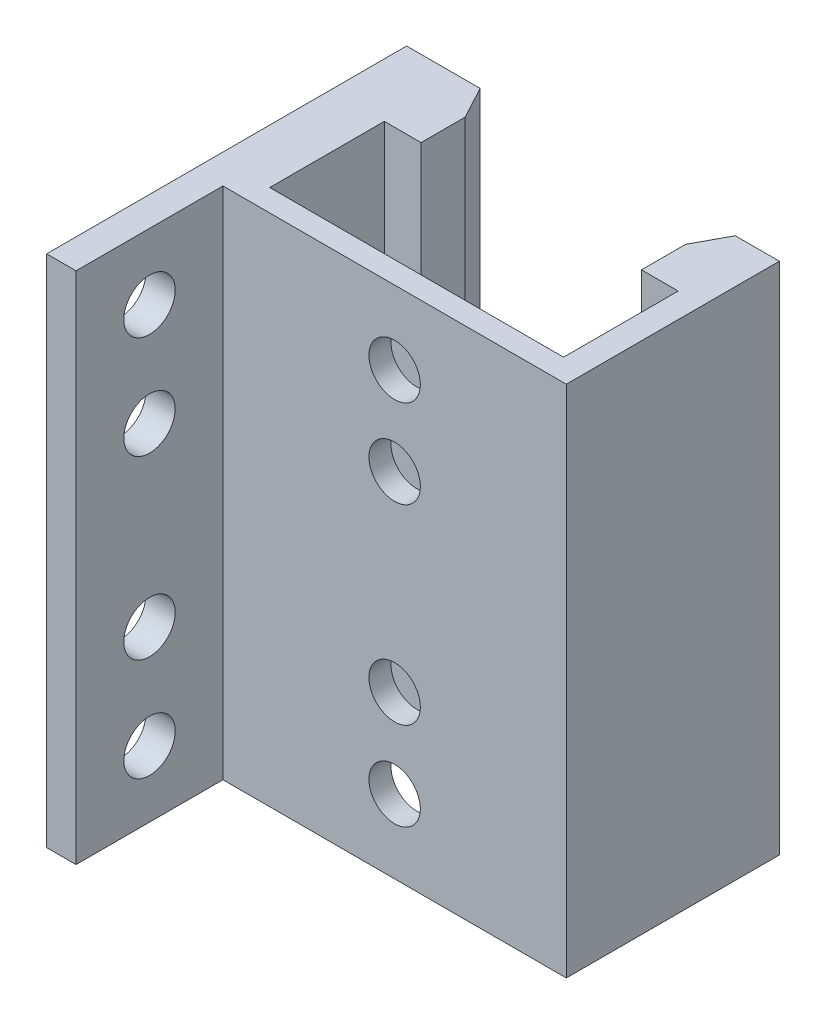
ISO-10303-21;
HEADER;
FILE_DESCRIPTION(('STEP AP214'),'2;1');
FILE_NAME('part.step','',(''),(''),'','','');
FILE_SCHEMA(('AUTOMOTIVE_DESIGN { 1 0 10303 214 1 1 1 1 }'));
ENDSEC;
DATA;
#1=APPLICATION_CONTEXT('core data for automotive mechanical design processes');
#2=APPLICATION_PROTOCOL_DEFINITION('international standard','automotive_design',2000,#1);
#3=PRODUCT_CONTEXT('',#1,'mechanical');
#4=PRODUCT('Part','Part','',(#3));
#5=PRODUCT_RELATED_PRODUCT_CATEGORY('part','',(#4));
#6=PRODUCT_DEFINITION_FORMATION('','',#4);
#7=PRODUCT_DEFINITION_CONTEXT('part definition',#1,'design');
#8=PRODUCT_DEFINITION('design','',#6,#7);
#9=PRODUCT_DEFINITION_SHAPE('','',#8);
#10=(LENGTH_UNIT() NAMED_UNIT(*) SI_UNIT(.MILLI.,.METRE.));
#11=(NAMED_UNIT(*) PLANE_ANGLE_UNIT() SI_UNIT($,.RADIAN.));
#12=(NAMED_UNIT(*) SI_UNIT($,.STERADIAN.) SOLID_ANGLE_UNIT());
#13=UNCERTAINTY_MEASURE_WITH_UNIT(LENGTH_MEASURE(1.E-05),#10,'distance_accuracy_value','');
#14=(GEOMETRIC_REPRESENTATION_CONTEXT(3) GLOBAL_UNCERTAINTY_ASSIGNED_CONTEXT((#13)) GLOBAL_UNIT_ASSIGNED_CONTEXT((#10,
#11,#12)) REPRESENTATION_CONTEXT('',''));
#15=CARTESIAN_POINT('',(0.,0.,0.));
#16=DIRECTION('',(0.,0.,1.));
#17=DIRECTION('',(1.,0.,0.));
#18=AXIS2_PLACEMENT_3D('',#15,#16,#17);
#19=CARTESIAN_POINT('',(9.99999999999999,35.,-9.3));
#20=DIRECTION('',(1.,0.,0.));
#21=DIRECTION('',(0.,0.,-1.));
#22=AXIS2_PLACEMENT_3D('',#19,#20,#21);
#23=PLANE('',#22);
#24=DIRECTION('',(0.,0.,1.));
#25=VECTOR('',#24,1.);
#26=CARTESIAN_POINT('',(9.99999999999999,0.,-9.3));
#27=LINE('',#26,#25);
#28=CARTESIAN_POINT('',(9.99999999999999,0.,-9.3));
#29=VERTEX_POINT('',#28);
#30=CARTESIAN_POINT('',(10.,0.,-1.5));
#31=VERTEX_POINT('',#30);
#32=EDGE_CURVE('E161',#29,#31,#27,.T.);
#33=ORIENTED_EDGE('',*,*,#32,.T.);
#34=DIRECTION('',(0.,-1.,0.));
#35=VECTOR('',#34,1.);
#36=CARTESIAN_POINT('',(10.,35.,-1.5));
#37=LINE('',#36,#35);
#38=CARTESIAN_POINT('',(10.,35.,-1.5));
#39=VERTEX_POINT('',#38);
#40=EDGE_CURVE('E11',#39,#31,#37,.T.);
#41=ORIENTED_EDGE('',*,*,#40,.F.);
#42=DIRECTION('',(0.,0.,1.));
#43=VECTOR('',#42,1.);
#44=CARTESIAN_POINT('',(9.99999999999999,35.,-9.3));
#45=LINE('',#44,#43);
#46=CARTESIAN_POINT('',(9.99999999999999,35.,-9.3));
#47=VERTEX_POINT('',#46);
#48=EDGE_CURVE('E191',#47,#39,#45,.T.);
#49=ORIENTED_EDGE('',*,*,#48,.F.);
#50=DIRECTION('',(0.,-1.,0.));
#51=VECTOR('',#50,1.);
#52=CARTESIAN_POINT('',(9.99999999999999,35.,-9.3));
#53=LINE('',#52,#51);
#54=EDGE_CURVE('E157',#47,#29,#53,.T.);
#55=ORIENTED_EDGE('',*,*,#54,.T.);
#56=EDGE_LOOP('',(#33,#41,#49,#55));
#57=FACE_BOUND('',#56,.T.);
#58=ADVANCED_FACE('F33',(#57),#23,.F.);
#59=CARTESIAN_POINT('',(10.,35.,-1.5));
#60=DIRECTION('',(0.,0.,1.));
#61=DIRECTION('',(1.,0.,0.));
#62=AXIS2_PLACEMENT_3D('',#59,#60,#61);
#63=PLANE('',#62);
#64=CARTESIAN_POINT('',(0.,11.,-1.49999999999998));
#65=DIRECTION('',(0.,0.,1.));
#66=DIRECTION('',(1.,0.,0.));
#67=AXIS2_PLACEMENT_3D('',#64,#65,#66);
#68=CIRCLE('',#67,1.75);
#69=CARTESIAN_POINT('',(1.75,11.,-1.49999999999998));
#70=VERTEX_POINT('',#69);
#71=EDGE_CURVE('E256',#70,#70,#68,.T.);
#72=ORIENTED_EDGE('',*,*,#71,.T.);
#73=EDGE_LOOP('',(#72));
#74=FACE_BOUND('',#73,.T.);
#75=CARTESIAN_POINT('',(0.,30.,-1.49999999999998));
#76=DIRECTION('',(0.,0.,1.));
#77=DIRECTION('',(1.,0.,0.));
#78=AXIS2_PLACEMENT_3D('',#75,#76,#77);
#79=CIRCLE('',#78,1.75);
#80=CARTESIAN_POINT('',(1.75,30.,-1.49999999999998));
#81=VERTEX_POINT('',#80);
#82=EDGE_CURVE('E250',#81,#81,#79,.T.);
#83=ORIENTED_EDGE('',*,*,#82,.T.);
#84=EDGE_LOOP('',(#83));
#85=FACE_BOUND('',#84,.T.);
#86=CARTESIAN_POINT('',(0.,5.,-1.49999999999998));
#87=DIRECTION('',(0.,0.,1.));
#88=DIRECTION('',(1.,0.,0.));
#89=AXIS2_PLACEMENT_3D('',#86,#87,#88);
#90=CIRCLE('',#89,1.75);
#91=CARTESIAN_POINT('',(1.75,5.,-1.49999999999998));
#92=VERTEX_POINT('',#91);
#93=EDGE_CURVE('E244',#92,#92,#90,.T.);
#94=ORIENTED_EDGE('',*,*,#93,.T.);
#95=EDGE_LOOP('',(#94));
#96=FACE_BOUND('',#95,.T.);
#97=CARTESIAN_POINT('',(0.,24.,-1.49999999999998));
#98=DIRECTION('',(0.,0.,1.));
#99=DIRECTION('',(1.,0.,0.));
#100=AXIS2_PLACEMENT_3D('',#97,#98,#99);
#101=CIRCLE('',#100,1.75);
#102=CARTESIAN_POINT('',(1.75,24.,-1.49999999999998));
#103=VERTEX_POINT('',#102);
#104=EDGE_CURVE('E165',#103,#103,#101,.T.);
#105=ORIENTED_EDGE('',*,*,#104,.T.);
#106=EDGE_LOOP('',(#105));
#107=FACE_BOUND('',#106,.T.);
#108=DIRECTION('',(-1.,0.,0.));
#109=VECTOR('',#108,1.);
#110=CARTESIAN_POINT('',(10.,0.,-1.5));
#111=LINE('',#110,#109);
#112=CARTESIAN_POINT('',(-10.,0.,-1.49999999999995));
#113=VERTEX_POINT('',#112);
#114=EDGE_CURVE('E164',#31,#113,#111,.T.);
#115=ORIENTED_EDGE('',*,*,#114,.T.);
#116=DIRECTION('',(0.,-1.,0.));
#117=VECTOR('',#116,1.);
#118=CARTESIAN_POINT('',(-10.,35.,-1.49999999999995));
#119=LINE('',#118,#117);
#120=CARTESIAN_POINT('',(-10.,35.,-1.49999999999995));
#121=VERTEX_POINT('',#120);
#122=EDGE_CURVE('E42',#121,#113,#119,.T.);
#123=ORIENTED_EDGE('',*,*,#122,.F.);
#124=DIRECTION('',(-1.,0.,0.));
#125=VECTOR('',#124,1.);
#126=CARTESIAN_POINT('',(10.,35.,-1.5));
#127=LINE('',#126,#125);
#128=EDGE_CURVE('E110',#39,#121,#127,.T.);
#129=ORIENTED_EDGE('',*,*,#128,.F.);
#130=ORIENTED_EDGE('',*,*,#40,.T.);
#131=EDGE_LOOP('',(#115,#123,#129,#130));
#132=FACE_BOUND('',#131,.T.);
#133=ADVANCED_FACE('F348',(#74,#85,#96,#107,#132),#63,.F.);
#134=CARTESIAN_POINT('',(-10.,35.,-9.29999999999995));
#135=DIRECTION('',(1.,0.,0.));
#136=DIRECTION('',(0.,0.,-1.));
#137=AXIS2_PLACEMENT_3D('',#134,#135,#136);
#138=PLANE('',#137);
#139=DIRECTION('',(0.,0.,1.));
#140=VECTOR('',#139,1.);
#141=CARTESIAN_POINT('',(-10.,0.,-9.29999999999995));
#142=LINE('',#141,#140);
#143=CARTESIAN_POINT('',(-10.,0.,-9.29999999999995));
#144=VERTEX_POINT('',#143);
#145=EDGE_CURVE('E168',#144,#113,#142,.T.);
#146=ORIENTED_EDGE('',*,*,#145,.F.);
#147=DIRECTION('',(0.,-1.,0.));
#148=VECTOR('',#147,1.);
#149=CARTESIAN_POINT('',(-10.,35.,-9.29999999999995));
#150=LINE('',#149,#148);
#151=CARTESIAN_POINT('',(-10.,35.,-9.29999999999995));
#152=VERTEX_POINT('',#151);
#153=EDGE_CURVE('E343',#152,#144,#150,.T.);
#154=ORIENTED_EDGE('',*,*,#153,.F.);
#155=DIRECTION('',(0.,0.,1.));
#156=VECTOR('',#155,1.);
#157=CARTESIAN_POINT('',(-10.,35.,-9.29999999999995));
#158=LINE('',#157,#156);
#159=EDGE_CURVE('E234',#152,#121,#158,.T.);
#160=ORIENTED_EDGE('',*,*,#159,.T.);
#161=ORIENTED_EDGE('',*,*,#122,.T.);
#162=EDGE_LOOP('',(#146,#154,#160,#161));
#163=FACE_BOUND('',#162,.T.);
#164=ADVANCED_FACE('F347',(#163),#138,.T.);
#165=CARTESIAN_POINT('',(-7.50000000000004,35.,-9.29999999999996));
#166=DIRECTION('',(0.,0.,1.));
#167=DIRECTION('',(1.,0.,0.));
#168=AXIS2_PLACEMENT_3D('',#165,#166,#167);
#169=PLANE('',#168);
#170=DIRECTION('',(-1.,0.,0.));
#171=VECTOR('',#170,1.);
#172=CARTESIAN_POINT('',(-7.50000000000004,0.,-9.29999999999996));
#173=LINE('',#172,#171);
#174=CARTESIAN_POINT('',(-7.50000000000004,0.,-9.29999999999996));
#175=VERTEX_POINT('',#174);
#176=EDGE_CURVE('E171',#175,#144,#173,.T.);
#177=ORIENTED_EDGE('',*,*,#176,.F.);
#178=DIRECTION('',(0.,-1.,0.));
#179=VECTOR('',#178,1.);
#180=CARTESIAN_POINT('',(-7.50000000000004,35.,-9.29999999999996));
#181=LINE('',#180,#179);
#182=CARTESIAN_POINT('',(-7.50000000000004,35.,-9.29999999999996));
#183=VERTEX_POINT('',#182);
#184=EDGE_CURVE('E336',#183,#175,#181,.T.);
#185=ORIENTED_EDGE('',*,*,#184,.F.);
#186=DIRECTION('',(-1.,0.,0.));
#187=VECTOR('',#186,1.);
#188=CARTESIAN_POINT('',(-7.50000000000004,35.,-9.29999999999996));
#189=LINE('',#188,#187);
#190=EDGE_CURVE('E231',#183,#152,#189,.T.);
#191=ORIENTED_EDGE('',*,*,#190,.T.);
#192=ORIENTED_EDGE('',*,*,#153,.T.);
#193=EDGE_LOOP('',(#177,#185,#191,#192));
#194=FACE_BOUND('',#193,.T.);
#195=ADVANCED_FACE('F341',(#194),#169,.T.);
#196=CARTESIAN_POINT('',(-7.50000000000005,35.,-12.3));
#197=DIRECTION('',(1.,0.,0.));
#198=DIRECTION('',(0.,0.,-1.));
#199=AXIS2_PLACEMENT_3D('',#196,#197,#198);
#200=PLANE('',#199);
#201=DIRECTION('',(0.,0.,1.));
#202=VECTOR('',#201,1.);
#203=CARTESIAN_POINT('',(-7.50000000000005,0.,-12.3));
#204=LINE('',#203,#202);
#205=CARTESIAN_POINT('',(-7.50000000000005,0.,-12.3));
#206=VERTEX_POINT('',#205);
#207=EDGE_CURVE('E174',#206,#175,#204,.T.);
#208=ORIENTED_EDGE('',*,*,#207,.F.);
#209=DIRECTION('',(0.,-1.,0.));
#210=VECTOR('',#209,1.);
#211=CARTESIAN_POINT('',(-7.50000000000005,35.,-12.3));
#212=LINE('',#211,#210);
#213=CARTESIAN_POINT('',(-7.50000000000005,35.,-12.3));
#214=VERTEX_POINT('',#213);
#215=EDGE_CURVE('E331',#214,#206,#212,.T.);
#216=ORIENTED_EDGE('',*,*,#215,.F.);
#217=DIRECTION('',(0.,0.,1.));
#218=VECTOR('',#217,1.);
#219=CARTESIAN_POINT('',(-7.50000000000005,35.,-12.3));
#220=LINE('',#219,#218);
#221=EDGE_CURVE('E226',#214,#183,#220,.T.);
#222=ORIENTED_EDGE('',*,*,#221,.T.);
#223=ORIENTED_EDGE('',*,*,#184,.T.);
#224=EDGE_LOOP('',(#208,#216,#222,#223));
#225=FACE_BOUND('',#224,.T.);
#226=ADVANCED_FACE('F337',(#225),#200,.T.);
#227=CARTESIAN_POINT('',(-8.68380062305301,35.,-14.5));
#228=DIRECTION('',(0.88060720024894,0.,-0.473846978327101));
#229=DIRECTION('',(-0.473846978327101,0.,-0.88060720024894));
#230=AXIS2_PLACEMENT_3D('',#227,#228,#229);
#231=PLANE('',#230);
#232=DIRECTION('',(0.473846978327101,0.,0.88060720024894));
#233=VECTOR('',#232,1.);
#234=CARTESIAN_POINT('',(-8.68380062305301,0.,-14.5));
#235=LINE('',#234,#233);
#236=CARTESIAN_POINT('',(-8.68380062305301,0.,-14.5));
#237=VERTEX_POINT('',#236);
#238=EDGE_CURVE('E177',#237,#206,#235,.T.);
#239=ORIENTED_EDGE('',*,*,#238,.F.);
#240=DIRECTION('',(0.,-1.,0.));
#241=VECTOR('',#240,1.);
#242=CARTESIAN_POINT('',(-8.68380062305301,35.,-14.5));
#243=LINE('',#242,#241);
#244=CARTESIAN_POINT('',(-8.68380062305301,35.,-14.5));
#245=VERTEX_POINT('',#244);
#246=EDGE_CURVE('E204',#245,#237,#243,.T.);
#247=ORIENTED_EDGE('',*,*,#246,.F.);
#248=DIRECTION('',(0.473846978327101,0.,0.88060720024894));
#249=VECTOR('',#248,1.);
#250=CARTESIAN_POINT('',(-8.68380062305301,35.,-14.5));
#251=LINE('',#250,#249);
#252=EDGE_CURVE('E220',#245,#214,#251,.T.);
#253=ORIENTED_EDGE('',*,*,#252,.T.);
#254=ORIENTED_EDGE('',*,*,#215,.T.);
#255=EDGE_LOOP('',(#239,#247,#253,#254));
#256=FACE_BOUND('',#255,.T.);
#257=ADVANCED_FACE('F332',(#256),#231,.T.);
#258=CARTESIAN_POINT('',(-11.683800623053,35.,-14.4999999999999));
#259=DIRECTION('',(0.,0.,-1.));
#260=DIRECTION('',(-1.,0.,0.));
#261=AXIS2_PLACEMENT_3D('',#258,#259,#260);
#262=PLANE('',#261);
#263=DIRECTION('',(1.,0.,0.));
#264=VECTOR('',#263,1.);
#265=CARTESIAN_POINT('',(-11.683800623053,0.,-14.4999999999999));
#266=LINE('',#265,#264);
#267=CARTESIAN_POINT('',(-13.683800623053,0.,-14.4999999999999));
#268=VERTEX_POINT('',#267);
#269=EDGE_CURVE('E180',#268,#237,#266,.T.);
#270=ORIENTED_EDGE('',*,*,#269,.F.);
#271=DIRECTION('',(0.,-1.,0.));
#272=VECTOR('',#271,1.);
#273=CARTESIAN_POINT('',(-13.683800623053,0.,-14.4999999999999));
#274=LINE('',#273,#272);
#275=CARTESIAN_POINT('',(-13.683800623053,35.,-14.4999999999999));
#276=VERTEX_POINT('',#275);
#277=EDGE_CURVE('E276',#276,#268,#274,.T.);
#278=ORIENTED_EDGE('',*,*,#277,.F.);
#279=DIRECTION('',(1.,0.,0.));
#280=VECTOR('',#279,1.);
#281=CARTESIAN_POINT('',(-11.683800623053,35.,-14.4999999999999));
#282=LINE('',#281,#280);
#283=EDGE_CURVE('E214',#276,#245,#282,.T.);
#284=ORIENTED_EDGE('',*,*,#283,.T.);
#285=ORIENTED_EDGE('',*,*,#246,.T.);
#286=EDGE_LOOP('',(#270,#278,#284,#285));
#287=FACE_BOUND('',#286,.T.);
#288=ADVANCED_FACE('F328',(#287),#262,.T.);
#289=CARTESIAN_POINT('',(-11.683800623053,35.,0.));
#290=DIRECTION('',(0.,0.,-1.));
#291=DIRECTION('',(-1.,0.,0.));
#292=AXIS2_PLACEMENT_3D('',#289,#290,#291);
#293=PLANE('',#292);
#294=CARTESIAN_POINT('',(0.,11.,0.));
#295=DIRECTION('',(0.,0.,1.));
#296=DIRECTION('',(1.,0.,0.));
#297=AXIS2_PLACEMENT_3D('',#294,#295,#296);
#298=CIRCLE('',#297,1.75);
#299=CARTESIAN_POINT('',(1.75,11.,0.));
#300=VERTEX_POINT('',#299);
#301=EDGE_CURVE('E259',#300,#300,#298,.T.);
#302=ORIENTED_EDGE('',*,*,#301,.F.);
#303=EDGE_LOOP('',(#302));
#304=FACE_BOUND('',#303,.T.);
#305=CARTESIAN_POINT('',(0.,30.,0.));
#306=DIRECTION('',(0.,0.,1.));
#307=DIRECTION('',(1.,0.,0.));
#308=AXIS2_PLACEMENT_3D('',#305,#306,#307);
#309=CIRCLE('',#308,1.75);
#310=CARTESIAN_POINT('',(1.75,30.,0.));
#311=VERTEX_POINT('',#310);
#312=EDGE_CURVE('E253',#311,#311,#309,.T.);
#313=ORIENTED_EDGE('',*,*,#312,.F.);
#314=EDGE_LOOP('',(#313));
#315=FACE_BOUND('',#314,.T.);
#316=CARTESIAN_POINT('',(0.,5.,0.));
#317=DIRECTION('',(0.,0.,1.));
#318=DIRECTION('',(1.,0.,0.));
#319=AXIS2_PLACEMENT_3D('',#316,#317,#318);
#320=CIRCLE('',#319,1.75);
#321=CARTESIAN_POINT('',(1.75,5.,0.));
#322=VERTEX_POINT('',#321);
#323=EDGE_CURVE('E247',#322,#322,#320,.T.);
#324=ORIENTED_EDGE('',*,*,#323,.F.);
#325=EDGE_LOOP('',(#324));
#326=FACE_BOUND('',#325,.T.);
#327=CARTESIAN_POINT('',(0.,24.,0.));
#328=DIRECTION('',(0.,0.,1.));
#329=DIRECTION('',(1.,0.,0.));
#330=AXIS2_PLACEMENT_3D('',#327,#328,#329);
#331=CIRCLE('',#330,1.75);
#332=CARTESIAN_POINT('',(1.75,24.,0.));
#333=VERTEX_POINT('',#332);
#334=EDGE_CURVE('E241',#333,#333,#331,.T.);
#335=ORIENTED_EDGE('',*,*,#334,.F.);
#336=EDGE_LOOP('',(#335));
#337=FACE_BOUND('',#336,.T.);
#338=DIRECTION('',(1.,0.,0.));
#339=VECTOR('',#338,1.);
#340=CARTESIAN_POINT('',(-11.683800623053,0.,0.));
#341=LINE('',#340,#339);
#342=CARTESIAN_POINT('',(-11.683800623053,0.,0.));
#343=VERTEX_POINT('',#342);
#344=CARTESIAN_POINT('',(11.683800623053,0.,0.));
#345=VERTEX_POINT('',#344);
#346=EDGE_CURVE('E183',#343,#345,#341,.T.);
#347=ORIENTED_EDGE('',*,*,#346,.T.);
#348=DIRECTION('',(0.,-1.,0.));
#349=VECTOR('',#348,1.);
#350=CARTESIAN_POINT('',(11.683800623053,35.,0.));
#351=LINE('',#350,#349);
#352=CARTESIAN_POINT('',(11.683800623053,35.,0.));
#353=VERTEX_POINT('',#352);
#354=EDGE_CURVE('E198',#353,#345,#351,.T.);
#355=ORIENTED_EDGE('',*,*,#354,.F.);
#356=DIRECTION('',(1.,0.,0.));
#357=VECTOR('',#356,1.);
#358=CARTESIAN_POINT('',(-11.683800623053,35.,0.));
#359=LINE('',#358,#357);
#360=CARTESIAN_POINT('',(-11.683800623053,35.,0.));
#361=VERTEX_POINT('',#360);
#362=EDGE_CURVE('E212',#361,#353,#359,.T.);
#363=ORIENTED_EDGE('',*,*,#362,.F.);
#364=DIRECTION('',(0.,-1.,0.));
#365=VECTOR('',#364,1.);
#366=CARTESIAN_POINT('',(-11.683800623053,35.,0.));
#367=LINE('',#366,#365);
#368=EDGE_CURVE('E201',#361,#343,#367,.T.);
#369=ORIENTED_EDGE('',*,*,#368,.T.);
#370=EDGE_LOOP('',(#347,#355,#363,#369));
#371=FACE_BOUND('',#370,.T.);
#372=ADVANCED_FACE('F381',(#304,#315,#326,#337,#371),#293,.F.);
#373=CARTESIAN_POINT('',(11.683800623053,35.,0.));
#374=DIRECTION('',(-1.,0.,0.));
#375=DIRECTION('',(0.,0.,1.));
#376=AXIS2_PLACEMENT_3D('',#373,#374,#375);
#377=PLANE('',#376);
#378=DIRECTION('',(0.,0.,-1.));
#379=VECTOR('',#378,1.);
#380=CARTESIAN_POINT('',(11.683800623053,0.,0.));
#381=LINE('',#380,#379);
#382=CARTESIAN_POINT('',(11.6838006230529,0.,-14.5));
#383=VERTEX_POINT('',#382);
#384=EDGE_CURVE('E184',#345,#383,#381,.T.);
#385=ORIENTED_EDGE('',*,*,#384,.T.);
#386=DIRECTION('',(0.,-1.,0.));
#387=VECTOR('',#386,1.);
#388=CARTESIAN_POINT('',(11.6838006230529,35.,-14.5));
#389=LINE('',#388,#387);
#390=CARTESIAN_POINT('',(11.6838006230529,35.,-14.5));
#391=VERTEX_POINT('',#390);
#392=EDGE_CURVE('E195',#391,#383,#389,.T.);
#393=ORIENTED_EDGE('',*,*,#392,.F.);
#394=DIRECTION('',(0.,0.,-1.));
#395=VECTOR('',#394,1.);
#396=CARTESIAN_POINT('',(11.683800623053,35.,0.));
#397=LINE('',#396,#395);
#398=EDGE_CURVE('E213',#353,#391,#397,.T.);
#399=ORIENTED_EDGE('',*,*,#398,.F.);
#400=ORIENTED_EDGE('',*,*,#354,.T.);
#401=EDGE_LOOP('',(#385,#393,#399,#400));
#402=FACE_BOUND('',#401,.T.);
#403=ADVANCED_FACE('F384',(#402),#377,.F.);
#404=CARTESIAN_POINT('',(11.6838006230529,35.,-14.5));
#405=DIRECTION('',(0.,0.,1.));
#406=DIRECTION('',(1.,0.,0.));
#407=AXIS2_PLACEMENT_3D('',#404,#405,#406);
#408=PLANE('',#407);
#409=DIRECTION('',(-1.,0.,0.));
#410=VECTOR('',#409,1.);
#411=CARTESIAN_POINT('',(11.6838006230529,0.,-14.5));
#412=LINE('',#411,#410);
#413=CARTESIAN_POINT('',(8.68380062305295,0.,-14.5));
#414=VERTEX_POINT('',#413);
#415=EDGE_CURVE('E186',#383,#414,#412,.T.);
#416=ORIENTED_EDGE('',*,*,#415,.T.);
#417=DIRECTION('',(0.,-1.,0.));
#418=VECTOR('',#417,1.);
#419=CARTESIAN_POINT('',(8.68380062305295,35.,-14.5));
#420=LINE('',#419,#418);
#421=CARTESIAN_POINT('',(8.68380062305295,35.,-14.5));
#422=VERTEX_POINT('',#421);
#423=EDGE_CURVE('E152',#422,#414,#420,.T.);
#424=ORIENTED_EDGE('',*,*,#423,.F.);
#425=DIRECTION('',(-1.,0.,0.));
#426=VECTOR('',#425,1.);
#427=CARTESIAN_POINT('',(11.6838006230529,35.,-14.5));
#428=LINE('',#427,#426);
#429=EDGE_CURVE('E143',#391,#422,#428,.T.);
#430=ORIENTED_EDGE('',*,*,#429,.F.);
#431=ORIENTED_EDGE('',*,*,#392,.T.);
#432=EDGE_LOOP('',(#416,#424,#430,#431));
#433=FACE_BOUND('',#432,.T.);
#434=ADVANCED_FACE('F388',(#433),#408,.F.);
#435=CARTESIAN_POINT('',(8.68380062305295,35.,-14.5));
#436=DIRECTION('',(0.880607200248942,0.,0.473846978327097));
#437=DIRECTION('',(0.473846978327097,0.,-0.880607200248942));
#438=AXIS2_PLACEMENT_3D('',#435,#436,#437);
#439=PLANE('',#438);
#440=DIRECTION('',(-0.473846978327097,0.,0.880607200248942));
#441=VECTOR('',#440,1.);
#442=CARTESIAN_POINT('',(8.68380062305295,0.,-14.5));
#443=LINE('',#442,#441);
#444=CARTESIAN_POINT('',(7.5,0.,-12.3));
#445=VERTEX_POINT('',#444);
#446=EDGE_CURVE('E151',#414,#445,#443,.T.);
#447=ORIENTED_EDGE('',*,*,#446,.T.);
#448=DIRECTION('',(0.,-1.,0.));
#449=VECTOR('',#448,1.);
#450=CARTESIAN_POINT('',(7.5,35.,-12.3));
#451=LINE('',#450,#449);
#452=CARTESIAN_POINT('',(7.5,35.,-12.3));
#453=VERTEX_POINT('',#452);
#454=EDGE_CURVE('E148',#453,#445,#451,.T.);
#455=ORIENTED_EDGE('',*,*,#454,.F.);
#456=DIRECTION('',(-0.473846978327097,0.,0.880607200248942));
#457=VECTOR('',#456,1.);
#458=CARTESIAN_POINT('',(8.68380062305295,35.,-14.5));
#459=LINE('',#458,#457);
#460=EDGE_CURVE('E137',#422,#453,#459,.T.);
#461=ORIENTED_EDGE('',*,*,#460,.F.);
#462=ORIENTED_EDGE('',*,*,#423,.T.);
#463=EDGE_LOOP('',(#447,#455,#461,#462));
#464=FACE_BOUND('',#463,.T.);
#465=ADVANCED_FACE('F149',(#464),#439,.F.);
#466=CARTESIAN_POINT('',(7.5,35.,-12.3));
#467=DIRECTION('',(1.,0.,0.));
#468=DIRECTION('',(0.,0.,-1.));
#469=AXIS2_PLACEMENT_3D('',#466,#467,#468);
#470=PLANE('',#469);
#471=DIRECTION('',(0.,0.,1.));
#472=VECTOR('',#471,1.);
#473=CARTESIAN_POINT('',(7.5,0.,-12.3));
#474=LINE('',#473,#472);
#475=CARTESIAN_POINT('',(7.5,0.,-9.3));
#476=VERTEX_POINT('',#475);
#477=EDGE_CURVE('E96',#445,#476,#474,.T.);
#478=ORIENTED_EDGE('',*,*,#477,.T.);
#479=DIRECTION('',(0.,-1.,0.));
#480=VECTOR('',#479,1.);
#481=CARTESIAN_POINT('',(7.5,35.,-9.3));
#482=LINE('',#481,#480);
#483=CARTESIAN_POINT('',(7.5,35.,-9.3));
#484=VERTEX_POINT('',#483);
#485=EDGE_CURVE('E153',#484,#476,#482,.T.);
#486=ORIENTED_EDGE('',*,*,#485,.F.);
#487=DIRECTION('',(0.,0.,1.));
#488=VECTOR('',#487,1.);
#489=CARTESIAN_POINT('',(7.5,35.,-12.3));
#490=LINE('',#489,#488);
#491=EDGE_CURVE('E141',#453,#484,#490,.T.);
#492=ORIENTED_EDGE('',*,*,#491,.F.);
#493=ORIENTED_EDGE('',*,*,#454,.T.);
#494=EDGE_LOOP('',(#478,#486,#492,#493));
#495=FACE_BOUND('',#494,.T.);
#496=ADVANCED_FACE('F155',(#495),#470,.F.);
#497=CARTESIAN_POINT('',(7.5,35.,-9.3));
#498=DIRECTION('',(0.,0.,-1.));
#499=DIRECTION('',(-1.,0.,0.));
#500=AXIS2_PLACEMENT_3D('',#497,#498,#499);
#501=PLANE('',#500);
#502=DIRECTION('',(1.,0.,0.));
#503=VECTOR('',#502,1.);
#504=CARTESIAN_POINT('',(7.5,0.,-9.3));
#505=LINE('',#504,#503);
#506=EDGE_CURVE('E102',#476,#29,#505,.T.);
#507=ORIENTED_EDGE('',*,*,#506,.T.);
#508=ORIENTED_EDGE('',*,*,#54,.F.);
#509=DIRECTION('',(1.,0.,0.));
#510=VECTOR('',#509,1.);
#511=CARTESIAN_POINT('',(7.5,35.,-9.3));
#512=LINE('',#511,#510);
#513=EDGE_CURVE('E51',#484,#47,#512,.T.);
#514=ORIENTED_EDGE('',*,*,#513,.F.);
#515=ORIENTED_EDGE('',*,*,#485,.T.);
#516=EDGE_LOOP('',(#507,#508,#514,#515));
#517=FACE_BOUND('',#516,.T.);
#518=ADVANCED_FACE('F352',(#517),#501,.F.);
#519=CARTESIAN_POINT('',(0.,35.,0.));
#520=DIRECTION('',(0.,-1.,0.));
#521=DIRECTION('',(0.,0.,-1.));
#522=AXIS2_PLACEMENT_3D('',#519,#520,#521);
#523=PLANE('',#522);
#524=ORIENTED_EDGE('',*,*,#48,.T.);
#525=ORIENTED_EDGE('',*,*,#128,.T.);
#526=ORIENTED_EDGE('',*,*,#159,.F.);
#527=ORIENTED_EDGE('',*,*,#190,.F.);
#528=ORIENTED_EDGE('',*,*,#221,.F.);
#529=ORIENTED_EDGE('',*,*,#252,.F.);
#530=ORIENTED_EDGE('',*,*,#283,.F.);
#531=DIRECTION('',(0.,0.,-1.));
#532=VECTOR('',#531,1.);
#533=CARTESIAN_POINT('',(-13.683800623053,35.,0.));
#534=LINE('',#533,#532);
#535=CARTESIAN_POINT('',(-13.6838006230529,35.,10.0000000000001));
#536=VERTEX_POINT('',#535);
#537=EDGE_CURVE('E313',#536,#276,#534,.T.);
#538=ORIENTED_EDGE('',*,*,#537,.F.);
#539=DIRECTION('',(1.,0.,0.));
#540=VECTOR('',#539,1.);
#541=CARTESIAN_POINT('',(-13.6838006230529,35.,10.0000000000001));
#542=LINE('',#541,#540);
#543=CARTESIAN_POINT('',(-11.6838006230529,35.,10.0000000000001));
#544=VERTEX_POINT('',#543);
#545=EDGE_CURVE('E274',#536,#544,#542,.T.);
#546=ORIENTED_EDGE('',*,*,#545,.T.);
#547=DIRECTION('',(0.,0.,-1.));
#548=VECTOR('',#547,1.);
#549=CARTESIAN_POINT('',(-11.683800623053,35.,-14.4999999999999));
#550=LINE('',#549,#548);
#551=EDGE_CURVE('E263',#544,#361,#550,.T.);
#552=ORIENTED_EDGE('',*,*,#551,.T.);
#553=ORIENTED_EDGE('',*,*,#362,.T.);
#554=ORIENTED_EDGE('',*,*,#398,.T.);
#555=ORIENTED_EDGE('',*,*,#429,.T.);
#556=ORIENTED_EDGE('',*,*,#460,.T.);
#557=ORIENTED_EDGE('',*,*,#491,.T.);
#558=ORIENTED_EDGE('',*,*,#513,.T.);
#559=EDGE_LOOP('',(#524,#525,#526,#527,#528,#529,#530,#538,#546,#552,#553,#554,#555,#556,#557,#558));
#560=FACE_BOUND('',#559,.T.);
#561=ADVANCED_FACE('F139',(#560),#523,.F.);
#562=CARTESIAN_POINT('',(0.,0.,0.));
#563=DIRECTION('',(0.,-1.,0.));
#564=DIRECTION('',(0.,0.,-1.));
#565=AXIS2_PLACEMENT_3D('',#562,#563,#564);
#566=PLANE('',#565);
#567=ORIENTED_EDGE('',*,*,#32,.F.);
#568=ORIENTED_EDGE('',*,*,#506,.F.);
#569=ORIENTED_EDGE('',*,*,#477,.F.);
#570=ORIENTED_EDGE('',*,*,#446,.F.);
#571=ORIENTED_EDGE('',*,*,#415,.F.);
#572=ORIENTED_EDGE('',*,*,#384,.F.);
#573=ORIENTED_EDGE('',*,*,#346,.F.);
#574=DIRECTION('',(0.,0.,1.));
#575=VECTOR('',#574,1.);
#576=CARTESIAN_POINT('',(-11.683800623053,0.,0.));
#577=LINE('',#576,#575);
#578=CARTESIAN_POINT('',(-11.6838006230529,0.,10.0000000000001));
#579=VERTEX_POINT('',#578);
#580=EDGE_CURVE('E268',#343,#579,#577,.T.);
#581=ORIENTED_EDGE('',*,*,#580,.T.);
#582=DIRECTION('',(1.,0.,0.));
#583=VECTOR('',#582,1.);
#584=CARTESIAN_POINT('',(-13.6838006230529,0.,10.0000000000001));
#585=LINE('',#584,#583);
#586=CARTESIAN_POINT('',(-13.6838006230529,0.,10.0000000000001));
#587=VERTEX_POINT('',#586);
#588=EDGE_CURVE('E262',#587,#579,#585,.T.);
#589=ORIENTED_EDGE('',*,*,#588,.F.);
#590=DIRECTION('',(0.,0.,1.));
#591=VECTOR('',#590,1.);
#592=CARTESIAN_POINT('',(-13.683800623053,0.,-14.4999999999999));
#593=LINE('',#592,#591);
#594=EDGE_CURVE('E266',#268,#587,#593,.T.);
#595=ORIENTED_EDGE('',*,*,#594,.F.);
#596=ORIENTED_EDGE('',*,*,#269,.T.);
#597=ORIENTED_EDGE('',*,*,#238,.T.);
#598=ORIENTED_EDGE('',*,*,#207,.T.);
#599=ORIENTED_EDGE('',*,*,#176,.T.);
#600=ORIENTED_EDGE('',*,*,#145,.T.);
#601=ORIENTED_EDGE('',*,*,#114,.F.);
#602=EDGE_LOOP('',(#567,#568,#569,#570,#571,#572,#573,#581,#589,#595,#596,#597,#598,#599,#600,#601));
#603=FACE_BOUND('',#602,.T.);
#604=ADVANCED_FACE('F326',(#603),#566,.T.);
#605=CARTESIAN_POINT('',(0.,24.,-10.));
#606=DIRECTION('',(0.,0.,1.));
#607=DIRECTION('',(1.,0.,0.));
#608=AXIS2_PLACEMENT_3D('',#605,#606,#607);
#609=CYLINDRICAL_SURFACE('',#608,1.75);
#610=ORIENTED_EDGE('',*,*,#334,.T.);
#611=EDGE_LOOP('',(#610));
#612=FACE_BOUND('',#611,.T.);
#613=ORIENTED_EDGE('',*,*,#104,.F.);
#614=EDGE_LOOP('',(#613));
#615=FACE_BOUND('',#614,.T.);
#616=ADVANCED_FACE('F418',(#612,#615),#609,.F.);
#617=CARTESIAN_POINT('',(0.,5.,-10.));
#618=DIRECTION('',(0.,0.,1.));
#619=DIRECTION('',(1.,0.,0.));
#620=AXIS2_PLACEMENT_3D('',#617,#618,#619);
#621=CYLINDRICAL_SURFACE('',#620,1.75);
#622=ORIENTED_EDGE('',*,*,#323,.T.);
#623=EDGE_LOOP('',(#622));
#624=FACE_BOUND('',#623,.T.);
#625=ORIENTED_EDGE('',*,*,#93,.F.);
#626=EDGE_LOOP('',(#625));
#627=FACE_BOUND('',#626,.T.);
#628=ADVANCED_FACE('F423',(#624,#627),#621,.F.);
#629=CARTESIAN_POINT('',(0.,30.,-10.));
#630=DIRECTION('',(0.,0.,1.));
#631=DIRECTION('',(1.,0.,0.));
#632=AXIS2_PLACEMENT_3D('',#629,#630,#631);
#633=CYLINDRICAL_SURFACE('',#632,1.75);
#634=ORIENTED_EDGE('',*,*,#312,.T.);
#635=EDGE_LOOP('',(#634));
#636=FACE_BOUND('',#635,.T.);
#637=ORIENTED_EDGE('',*,*,#82,.F.);
#638=EDGE_LOOP('',(#637));
#639=FACE_BOUND('',#638,.T.);
#640=ADVANCED_FACE('F435',(#636,#639),#633,.F.);
#641=CARTESIAN_POINT('',(0.,11.,-10.));
#642=DIRECTION('',(0.,0.,1.));
#643=DIRECTION('',(1.,0.,0.));
#644=AXIS2_PLACEMENT_3D('',#641,#642,#643);
#645=CYLINDRICAL_SURFACE('',#644,1.75);
#646=ORIENTED_EDGE('',*,*,#301,.T.);
#647=EDGE_LOOP('',(#646));
#648=FACE_BOUND('',#647,.T.);
#649=ORIENTED_EDGE('',*,*,#71,.F.);
#650=EDGE_LOOP('',(#649));
#651=FACE_BOUND('',#650,.T.);
#652=ADVANCED_FACE('F445',(#648,#651),#645,.F.);
#653=CARTESIAN_POINT('',(-13.6838006230529,0.,10.0000000000001));
#654=DIRECTION('',(0.,0.,-1.));
#655=DIRECTION('',(-1.,0.,0.));
#656=AXIS2_PLACEMENT_3D('',#653,#654,#655);
#657=PLANE('',#656);
#658=DIRECTION('',(0.,1.,0.));
#659=VECTOR('',#658,1.);
#660=CARTESIAN_POINT('',(-11.6838006230529,0.,10.0000000000001));
#661=LINE('',#660,#659);
#662=EDGE_CURVE('E267',#579,#544,#661,.T.);
#663=ORIENTED_EDGE('',*,*,#662,.T.);
#664=ORIENTED_EDGE('',*,*,#545,.F.);
#665=DIRECTION('',(0.,1.,0.));
#666=VECTOR('',#665,1.);
#667=CARTESIAN_POINT('',(-13.6838006230529,0.,10.0000000000001));
#668=LINE('',#667,#666);
#669=EDGE_CURVE('E289',#587,#536,#668,.T.);
#670=ORIENTED_EDGE('',*,*,#669,.F.);
#671=ORIENTED_EDGE('',*,*,#588,.T.);
#672=EDGE_LOOP('',(#663,#664,#670,#671));
#673=FACE_BOUND('',#672,.T.);
#674=ADVANCED_FACE('F284',(#673),#657,.F.);
#675=CARTESIAN_POINT('',(-13.683800623053,0.,0.));
#676=DIRECTION('',(-1.,0.,0.));
#677=DIRECTION('',(0.,0.,1.));
#678=AXIS2_PLACEMENT_3D('',#675,#676,#677);
#679=PLANE('',#678);
#680=CARTESIAN_POINT('',(-13.6838006230529,30.5,5.00000000000006));
#681=DIRECTION('',(-1.,0.,0.));
#682=DIRECTION('',(0.,0.,1.));
#683=AXIS2_PLACEMENT_3D('',#680,#681,#682);
#684=CIRCLE('',#683,1.75);
#685=CARTESIAN_POINT('',(-13.6838006230529,30.5,6.75000000000006));
#686=VERTEX_POINT('',#685);
#687=EDGE_CURVE('E555',#686,#686,#684,.T.);
#688=ORIENTED_EDGE('',*,*,#687,.F.);
#689=EDGE_LOOP('',(#688));
#690=FACE_BOUND('',#689,.T.);
#691=CARTESIAN_POINT('',(-13.6838006230529,23.5,5.00000000000006));
#692=DIRECTION('',(-1.,0.,0.));
#693=DIRECTION('',(0.,0.,1.));
#694=AXIS2_PLACEMENT_3D('',#691,#692,#693);
#695=CIRCLE('',#694,1.75);
#696=CARTESIAN_POINT('',(-13.6838006230529,23.5,6.75000000000007));
#697=VERTEX_POINT('',#696);
#698=EDGE_CURVE('E565',#697,#697,#695,.T.);
#699=ORIENTED_EDGE('',*,*,#698,.F.);
#700=EDGE_LOOP('',(#699));
#701=FACE_BOUND('',#700,.T.);
#702=CARTESIAN_POINT('',(-13.6838006230529,11.5,5.00000000000006));
#703=DIRECTION('',(-1.,0.,0.));
#704=DIRECTION('',(0.,0.,1.));
#705=AXIS2_PLACEMENT_3D('',#702,#703,#704);
#706=CIRCLE('',#705,1.75);
#707=CARTESIAN_POINT('',(-13.6838006230529,11.5,6.75000000000006));
#708=VERTEX_POINT('',#707);
#709=EDGE_CURVE('E306',#708,#708,#706,.T.);
#710=ORIENTED_EDGE('',*,*,#709,.F.);
#711=EDGE_LOOP('',(#710));
#712=FACE_BOUND('',#711,.T.);
#713=CARTESIAN_POINT('',(-13.6838006230529,4.5,5.00000000000006));
#714=DIRECTION('',(-1.,0.,0.));
#715=DIRECTION('',(0.,0.,1.));
#716=AXIS2_PLACEMENT_3D('',#713,#714,#715);
#717=CIRCLE('',#716,1.75);
#718=CARTESIAN_POINT('',(-13.6838006230529,4.5,6.75000000000006));
#719=VERTEX_POINT('',#718);
#720=EDGE_CURVE('E298',#719,#719,#717,.T.);
#721=ORIENTED_EDGE('',*,*,#720,.F.);
#722=EDGE_LOOP('',(#721));
#723=FACE_BOUND('',#722,.T.);
#724=ORIENTED_EDGE('',*,*,#594,.T.);
#725=ORIENTED_EDGE('',*,*,#669,.T.);
#726=ORIENTED_EDGE('',*,*,#537,.T.);
#727=ORIENTED_EDGE('',*,*,#277,.T.);
#728=EDGE_LOOP('',(#724,#725,#726,#727));
#729=FACE_BOUND('',#728,.T.);
#730=ADVANCED_FACE('F320',(#690,#701,#712,#723,#729),#679,.T.);
#731=CARTESIAN_POINT('',(-11.683800623053,0.,0.));
#732=DIRECTION('',(-1.,0.,0.));
#733=DIRECTION('',(0.,0.,1.));
#734=AXIS2_PLACEMENT_3D('',#731,#732,#733);
#735=PLANE('',#734);
#736=CARTESIAN_POINT('',(-11.6838006230529,30.5,5.00000000000005));
#737=DIRECTION('',(1.,0.,0.));
#738=DIRECTION('',(0.,0.,-1.));
#739=AXIS2_PLACEMENT_3D('',#736,#737,#738);
#740=CIRCLE('',#739,1.75);
#741=CARTESIAN_POINT('',(-11.6838006230529,30.5,3.25000000000005));
#742=VERTEX_POINT('',#741);
#743=EDGE_CURVE('E558',#742,#742,#740,.T.);
#744=ORIENTED_EDGE('',*,*,#743,.F.);
#745=EDGE_LOOP('',(#744));
#746=FACE_BOUND('',#745,.T.);
#747=CARTESIAN_POINT('',(-11.6838006230529,23.5,5.00000000000006));
#748=DIRECTION('',(1.,0.,0.));
#749=DIRECTION('',(0.,0.,-1.));
#750=AXIS2_PLACEMENT_3D('',#747,#748,#749);
#751=CIRCLE('',#750,1.75);
#752=CARTESIAN_POINT('',(-11.6838006230529,23.5,3.25000000000005));
#753=VERTEX_POINT('',#752);
#754=EDGE_CURVE('E560',#753,#753,#751,.T.);
#755=ORIENTED_EDGE('',*,*,#754,.F.);
#756=EDGE_LOOP('',(#755));
#757=FACE_BOUND('',#756,.T.);
#758=CARTESIAN_POINT('',(-11.6838006230529,11.5,5.00000000000005));
#759=DIRECTION('',(1.,0.,0.));
#760=DIRECTION('',(0.,0.,-1.));
#761=AXIS2_PLACEMENT_3D('',#758,#759,#760);
#762=CIRCLE('',#761,1.75);
#763=CARTESIAN_POINT('',(-11.6838006230529,11.5,3.25000000000005));
#764=VERTEX_POINT('',#763);
#765=EDGE_CURVE('E568',#764,#764,#762,.T.);
#766=ORIENTED_EDGE('',*,*,#765,.F.);
#767=EDGE_LOOP('',(#766));
#768=FACE_BOUND('',#767,.T.);
#769=CARTESIAN_POINT('',(-11.6838006230529,4.5,5.00000000000005));
#770=DIRECTION('',(1.,0.,0.));
#771=DIRECTION('',(0.,0.,-1.));
#772=AXIS2_PLACEMENT_3D('',#769,#770,#771);
#773=CIRCLE('',#772,1.75);
#774=CARTESIAN_POINT('',(-11.6838006230529,4.5,3.25000000000005));
#775=VERTEX_POINT('',#774);
#776=EDGE_CURVE('E301',#775,#775,#773,.T.);
#777=ORIENTED_EDGE('',*,*,#776,.F.);
#778=EDGE_LOOP('',(#777));
#779=FACE_BOUND('',#778,.T.);
#780=ORIENTED_EDGE('',*,*,#368,.F.);
#781=ORIENTED_EDGE('',*,*,#551,.F.);
#782=ORIENTED_EDGE('',*,*,#662,.F.);
#783=ORIENTED_EDGE('',*,*,#580,.F.);
#784=EDGE_LOOP('',(#780,#781,#782,#783));
#785=FACE_BOUND('',#784,.T.);
#786=ADVANCED_FACE('F297',(#746,#757,#768,#779,#785),#735,.F.);
#787=CARTESIAN_POINT('',(-15.1838006230529,4.5,5.00000000000007));
#788=DIRECTION('',(1.,0.,0.));
#789=DIRECTION('',(0.,0.,-1.));
#790=AXIS2_PLACEMENT_3D('',#787,#788,#789);
#791=CYLINDRICAL_SURFACE('',#790,1.75);
#792=ORIENTED_EDGE('',*,*,#720,.T.);
#793=EDGE_LOOP('',(#792));
#794=FACE_BOUND('',#793,.T.);
#795=ORIENTED_EDGE('',*,*,#776,.T.);
#796=EDGE_LOOP('',(#795));
#797=FACE_BOUND('',#796,.T.);
#798=ADVANCED_FACE('F509',(#794,#797),#791,.F.);
#799=CARTESIAN_POINT('',(-15.1838006230529,11.5,5.00000000000006));
#800=DIRECTION('',(1.,0.,0.));
#801=DIRECTION('',(0.,0.,-1.));
#802=AXIS2_PLACEMENT_3D('',#799,#800,#801);
#803=CYLINDRICAL_SURFACE('',#802,1.75);
#804=ORIENTED_EDGE('',*,*,#709,.T.);
#805=EDGE_LOOP('',(#804));
#806=FACE_BOUND('',#805,.T.);
#807=ORIENTED_EDGE('',*,*,#765,.T.);
#808=EDGE_LOOP('',(#807));
#809=FACE_BOUND('',#808,.T.);
#810=ADVANCED_FACE('F519',(#806,#809),#803,.F.);
#811=CARTESIAN_POINT('',(-15.1838006230529,23.5,5.00000000000007));
#812=DIRECTION('',(1.,0.,0.));
#813=DIRECTION('',(0.,0.,-1.));
#814=AXIS2_PLACEMENT_3D('',#811,#812,#813);
#815=CYLINDRICAL_SURFACE('',#814,1.75);
#816=ORIENTED_EDGE('',*,*,#698,.T.);
#817=EDGE_LOOP('',(#816));
#818=FACE_BOUND('',#817,.T.);
#819=ORIENTED_EDGE('',*,*,#754,.T.);
#820=EDGE_LOOP('',(#819));
#821=FACE_BOUND('',#820,.T.);
#822=ADVANCED_FACE('F528',(#818,#821),#815,.F.);
#823=CARTESIAN_POINT('',(-15.1838006230529,30.5,5.00000000000006));
#824=DIRECTION('',(1.,0.,0.));
#825=DIRECTION('',(0.,0.,-1.));
#826=AXIS2_PLACEMENT_3D('',#823,#824,#825);
#827=CYLINDRICAL_SURFACE('',#826,1.75);
#828=ORIENTED_EDGE('',*,*,#687,.T.);
#829=EDGE_LOOP('',(#828));
#830=FACE_BOUND('',#829,.T.);
#831=ORIENTED_EDGE('',*,*,#743,.T.);
#832=EDGE_LOOP('',(#831));
#833=FACE_BOUND('',#832,.T.);
#834=ADVANCED_FACE('F538',(#830,#833),#827,.F.);
#835=CLOSED_SHELL('',(#58,#133,#164,#195,#226,#257,#288,#372,#403,#434,#465,#496,#518,#561,#604,
#616,#628,#640,#652,#674,#730,#786,#798,#810,#822,#834));
#836=MANIFOLD_SOLID_BREP('B2',#835);
#837=ADVANCED_BREP_SHAPE_REPRESENTATION('',(#18,#836),#14);
#838=SHAPE_DEFINITION_REPRESENTATION(#9,#837);
ENDSEC;
END-ISO-10303-21;
